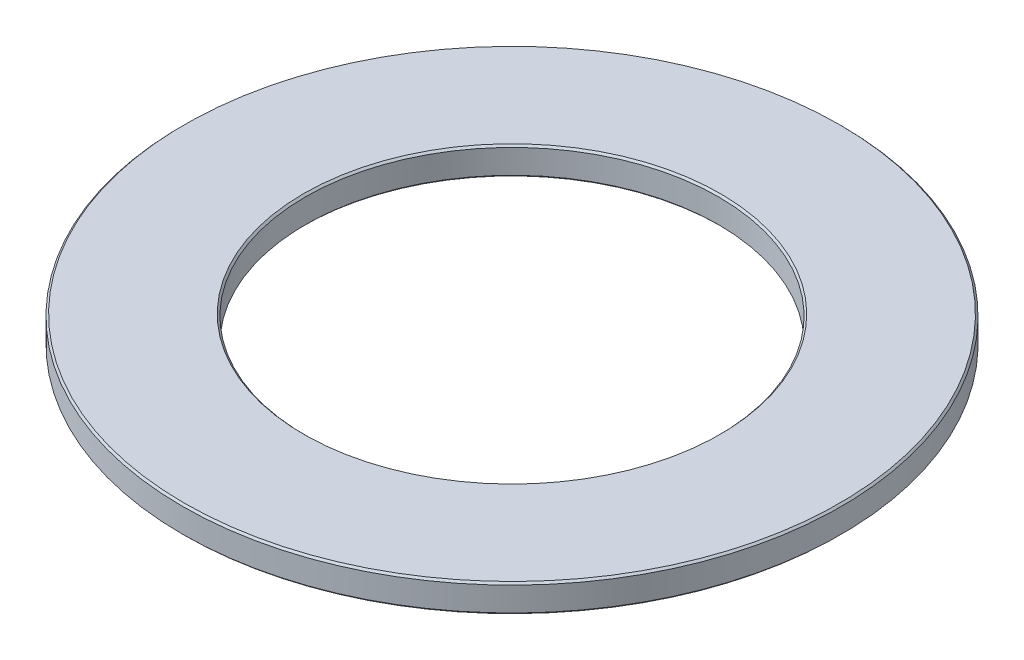
ISO-10303-21;
HEADER;
FILE_DESCRIPTION(('STEP AP214'),'2;1');
FILE_NAME('part.step','',(''),(''),'','','');
FILE_SCHEMA(('AUTOMOTIVE_DESIGN { 1 0 10303 214 1 1 1 1 }'));
ENDSEC;
DATA;
#1=APPLICATION_CONTEXT('core data for automotive mechanical design processes');
#2=APPLICATION_PROTOCOL_DEFINITION('international standard','automotive_design',2000,#1);
#3=PRODUCT_CONTEXT('',#1,'mechanical');
#4=PRODUCT('Part','Part','',(#3));
#5=PRODUCT_RELATED_PRODUCT_CATEGORY('part','',(#4));
#6=PRODUCT_DEFINITION_FORMATION('','',#4);
#7=PRODUCT_DEFINITION_CONTEXT('part definition',#1,'design');
#8=PRODUCT_DEFINITION('design','',#6,#7);
#9=PRODUCT_DEFINITION_SHAPE('','',#8);
#10=(LENGTH_UNIT() NAMED_UNIT(*) SI_UNIT(.MILLI.,.METRE.));
#11=(NAMED_UNIT(*) PLANE_ANGLE_UNIT() SI_UNIT($,.RADIAN.));
#12=(NAMED_UNIT(*) SI_UNIT($,.STERADIAN.) SOLID_ANGLE_UNIT());
#13=UNCERTAINTY_MEASURE_WITH_UNIT(LENGTH_MEASURE(1.E-05),#10,'distance_accuracy_value','');
#14=(GEOMETRIC_REPRESENTATION_CONTEXT(3) GLOBAL_UNCERTAINTY_ASSIGNED_CONTEXT((#13)) GLOBAL_UNIT_ASSIGNED_CONTEXT((#10,
#11,#12)) REPRESENTATION_CONTEXT('',''));
#15=CARTESIAN_POINT('',(0.,0.,0.));
#16=DIRECTION('',(0.,0.,1.));
#17=DIRECTION('',(1.,0.,0.));
#18=AXIS2_PLACEMENT_3D('',#15,#16,#17);
#19=CARTESIAN_POINT('',(0.,3.,0.));
#20=DIRECTION('',(0.,1.,0.));
#21=DIRECTION('',(0.,0.,1.));
#22=AXIS2_PLACEMENT_3D('',#19,#20,#21);
#23=PLANE('',#22);
#24=CARTESIAN_POINT('',(0.,3.,0.));
#25=DIRECTION('',(0.,-1.,0.));
#26=DIRECTION('',(0.,0.,-1.));
#27=AXIS2_PLACEMENT_3D('',#24,#25,#26);
#28=CIRCLE('',#27,35.3);
#29=CARTESIAN_POINT('',(0.,3.,-35.3));
#30=VERTEX_POINT('',#29);
#31=EDGE_CURVE('E31',#30,#30,#28,.T.);
#32=ORIENTED_EDGE('',*,*,#31,.F.);
#33=EDGE_LOOP('',(#32));
#34=FACE_BOUND('',#33,.T.);
#35=CARTESIAN_POINT('',(0.,3.,0.));
#36=DIRECTION('',(0.,1.,0.));
#37=DIRECTION('',(-1.,0.,0.));
#38=AXIS2_PLACEMENT_3D('',#35,#36,#37);
#39=CIRCLE('',#38,22.45);
#40=CARTESIAN_POINT('',(-22.45,3.,0.));
#41=VERTEX_POINT('',#40);
#42=EDGE_CURVE('E17',#41,#41,#39,.F.);
#43=ORIENTED_EDGE('',*,*,#42,.T.);
#44=EDGE_LOOP('',(#43));
#45=FACE_BOUND('',#44,.T.);
#46=ADVANCED_FACE('F14',(#34,#45),#23,.T.);
#47=CARTESIAN_POINT('',(0.,3.,0.));
#48=DIRECTION('',(0.,1.,0.));
#49=DIRECTION('',(-1.,0.,0.));
#50=AXIS2_PLACEMENT_3D('',#47,#48,#49);
#51=CONICAL_SURFACE('',#50,22.45,0.785398163397476);
#52=ORIENTED_EDGE('',*,*,#42,.F.);
#53=EDGE_LOOP('',(#52));
#54=FACE_BOUND('',#53,.T.);
#55=CARTESIAN_POINT('',(0.,2.80000000000002,0.));
#56=DIRECTION('',(0.,-1.,0.));
#57=DIRECTION('',(0.,0.,-1.));
#58=AXIS2_PLACEMENT_3D('',#55,#56,#57);
#59=CIRCLE('',#58,22.25);
#60=CARTESIAN_POINT('',(0.,2.80000000000002,-22.25));
#61=VERTEX_POINT('',#60);
#62=EDGE_CURVE('E29',#61,#61,#59,.T.);
#63=ORIENTED_EDGE('',*,*,#62,.T.);
#64=EDGE_LOOP('',(#63));
#65=FACE_BOUND('',#64,.T.);
#66=ADVANCED_FACE('F41',(#54,#65),#51,.F.);
#67=CARTESIAN_POINT('',(0.,2.79999999999997,0.));
#68=DIRECTION('',(0.,-1.,0.));
#69=DIRECTION('',(0.,0.,-1.));
#70=AXIS2_PLACEMENT_3D('',#67,#68,#69);
#71=CONICAL_SURFACE('',#70,35.5,0.78539816339743);
#72=ORIENTED_EDGE('',*,*,#31,.T.);
#73=EDGE_LOOP('',(#72));
#74=FACE_BOUND('',#73,.T.);
#75=CARTESIAN_POINT('',(0.,2.79999999999997,0.));
#76=DIRECTION('',(0.,-1.,0.));
#77=DIRECTION('',(0.,0.,-1.));
#78=AXIS2_PLACEMENT_3D('',#75,#76,#77);
#79=CIRCLE('',#78,35.5);
#80=CARTESIAN_POINT('',(0.,2.79999999999997,-35.5));
#81=VERTEX_POINT('',#80);
#82=EDGE_CURVE('E36',#81,#81,#79,.T.);
#83=ORIENTED_EDGE('',*,*,#82,.F.);
#84=EDGE_LOOP('',(#83));
#85=FACE_BOUND('',#84,.T.);
#86=ADVANCED_FACE('F44',(#74,#85),#71,.T.);
#87=CARTESIAN_POINT('',(0.,3.,0.));
#88=DIRECTION('',(0.,-1.,0.));
#89=DIRECTION('',(0.,0.,-1.));
#90=AXIS2_PLACEMENT_3D('',#87,#88,#89);
#91=CYLINDRICAL_SURFACE('',#90,22.25);
#92=CARTESIAN_POINT('',(0.,0.200000000000016,0.));
#93=DIRECTION('',(0.,-1.,0.));
#94=DIRECTION('',(0.,0.,-1.));
#95=AXIS2_PLACEMENT_3D('',#92,#93,#94);
#96=CIRCLE('',#95,22.25);
#97=CARTESIAN_POINT('',(0.,0.200000000000016,-22.25));
#98=VERTEX_POINT('',#97);
#99=EDGE_CURVE('E80',#98,#98,#96,.T.);
#100=ORIENTED_EDGE('',*,*,#99,.T.);
#101=EDGE_LOOP('',(#100));
#102=FACE_BOUND('',#101,.T.);
#103=ORIENTED_EDGE('',*,*,#62,.F.);
#104=EDGE_LOOP('',(#103));
#105=FACE_BOUND('',#104,.T.);
#106=ADVANCED_FACE('F47',(#102,#105),#91,.F.);
#107=CARTESIAN_POINT('',(0.,3.,0.));
#108=DIRECTION('',(0.,-1.,0.));
#109=DIRECTION('',(0.,0.,-1.));
#110=AXIS2_PLACEMENT_3D('',#107,#108,#109);
#111=CYLINDRICAL_SURFACE('',#110,35.5);
#112=ORIENTED_EDGE('',*,*,#82,.T.);
#113=EDGE_LOOP('',(#112));
#114=FACE_BOUND('',#113,.T.);
#115=CARTESIAN_POINT('',(0.,0.199999999999992,0.));
#116=DIRECTION('',(0.,1.,0.));
#117=DIRECTION('',(0.,0.,1.));
#118=AXIS2_PLACEMENT_3D('',#115,#116,#117);
#119=CIRCLE('',#118,35.5);
#120=CARTESIAN_POINT('',(0.,0.19999999999999,35.5));
#121=VERTEX_POINT('',#120);
#122=EDGE_CURVE('E26',#121,#121,#119,.F.);
#123=ORIENTED_EDGE('',*,*,#122,.F.);
#124=EDGE_LOOP('',(#123));
#125=FACE_BOUND('',#124,.T.);
#126=ADVANCED_FACE('F49',(#114,#125),#111,.T.);
#127=CARTESIAN_POINT('',(0.,0.,0.));
#128=DIRECTION('',(0.,-1.,0.));
#129=DIRECTION('',(0.,0.,-1.));
#130=AXIS2_PLACEMENT_3D('',#127,#128,#129);
#131=CONICAL_SURFACE('',#130,22.45,0.785398163397441);
#132=CARTESIAN_POINT('',(0.,0.,0.));
#133=DIRECTION('',(0.,-1.,0.));
#134=DIRECTION('',(0.,0.,-1.));
#135=AXIS2_PLACEMENT_3D('',#132,#133,#134);
#136=CIRCLE('',#135,22.45);
#137=CARTESIAN_POINT('',(0.,0.,-22.45));
#138=VERTEX_POINT('',#137);
#139=EDGE_CURVE('E21',#138,#138,#136,.T.);
#140=ORIENTED_EDGE('',*,*,#139,.T.);
#141=EDGE_LOOP('',(#140));
#142=FACE_BOUND('',#141,.T.);
#143=ORIENTED_EDGE('',*,*,#99,.F.);
#144=EDGE_LOOP('',(#143));
#145=FACE_BOUND('',#144,.T.);
#146=ADVANCED_FACE('F57',(#142,#145),#131,.F.);
#147=CARTESIAN_POINT('',(0.,0.199999999999991,0.));
#148=DIRECTION('',(0.,1.,0.));
#149=DIRECTION('',(0.,0.,1.));
#150=AXIS2_PLACEMENT_3D('',#147,#148,#149);
#151=CONICAL_SURFACE('',#150,35.5,0.78539816339745);
#152=CARTESIAN_POINT('',(0.,0.,0.));
#153=DIRECTION('',(0.,1.,0.));
#154=DIRECTION('',(0.,0.,1.));
#155=AXIS2_PLACEMENT_3D('',#152,#153,#154);
#156=CIRCLE('',#155,35.3);
#157=CARTESIAN_POINT('',(0.,0.,35.3));
#158=VERTEX_POINT('',#157);
#159=EDGE_CURVE('E10',#158,#158,#156,.T.);
#160=ORIENTED_EDGE('',*,*,#159,.T.);
#161=EDGE_LOOP('',(#160));
#162=FACE_BOUND('',#161,.T.);
#163=ORIENTED_EDGE('',*,*,#122,.T.);
#164=EDGE_LOOP('',(#163));
#165=FACE_BOUND('',#164,.T.);
#166=ADVANCED_FACE('F64',(#162,#165),#151,.T.);
#167=CARTESIAN_POINT('',(0.,0.,0.));
#168=DIRECTION('',(0.,1.,0.));
#169=DIRECTION('',(0.,0.,1.));
#170=AXIS2_PLACEMENT_3D('',#167,#168,#169);
#171=PLANE('',#170);
#172=ORIENTED_EDGE('',*,*,#159,.F.);
#173=EDGE_LOOP('',(#172));
#174=FACE_BOUND('',#173,.T.);
#175=ORIENTED_EDGE('',*,*,#139,.F.);
#176=EDGE_LOOP('',(#175));
#177=FACE_BOUND('',#176,.T.);
#178=ADVANCED_FACE('F62',(#174,#177),#171,.F.);
#179=CLOSED_SHELL('',(#46,#66,#86,#106,#126,#146,#166,#178));
#180=MANIFOLD_SOLID_BREP('B1',#179);
#181=ADVANCED_BREP_SHAPE_REPRESENTATION('',(#18,#180),#14);
#182=SHAPE_DEFINITION_REPRESENTATION(#9,#181);
ENDSEC;
END-ISO-10303-21;
